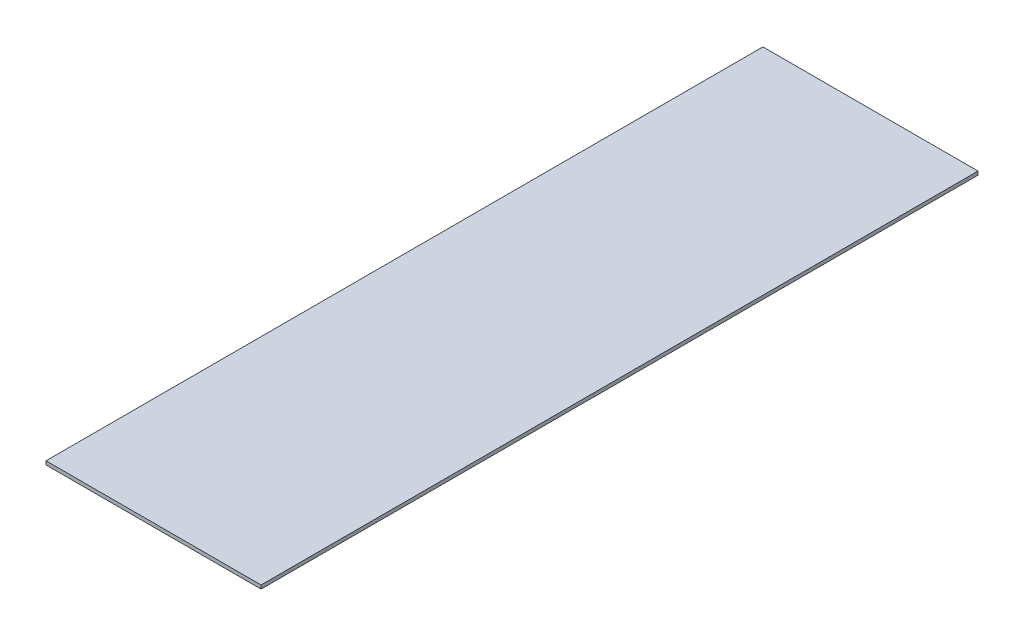
ISO-10303-21;
HEADER;
FILE_DESCRIPTION(('STEP AP214'),'2;1');
FILE_NAME('part.step','',(''),(''),'','','');
FILE_SCHEMA(('AUTOMOTIVE_DESIGN { 1 0 10303 214 1 1 1 1 }'));
ENDSEC;
DATA;
#1=APPLICATION_CONTEXT('core data for automotive mechanical design processes');
#2=APPLICATION_PROTOCOL_DEFINITION('international standard','automotive_design',2000,#1);
#3=PRODUCT_CONTEXT('',#1,'mechanical');
#4=PRODUCT('Part','Part','',(#3));
#5=PRODUCT_RELATED_PRODUCT_CATEGORY('part','',(#4));
#6=PRODUCT_DEFINITION_FORMATION('','',#4);
#7=PRODUCT_DEFINITION_CONTEXT('part definition',#1,'design');
#8=PRODUCT_DEFINITION('design','',#6,#7);
#9=PRODUCT_DEFINITION_SHAPE('','',#8);
#10=(LENGTH_UNIT() NAMED_UNIT(*) SI_UNIT(.MILLI.,.METRE.));
#11=(NAMED_UNIT(*) PLANE_ANGLE_UNIT() SI_UNIT($,.RADIAN.));
#12=(NAMED_UNIT(*) SI_UNIT($,.STERADIAN.) SOLID_ANGLE_UNIT());
#13=UNCERTAINTY_MEASURE_WITH_UNIT(LENGTH_MEASURE(1.E-05),#10,'distance_accuracy_value','');
#14=(GEOMETRIC_REPRESENTATION_CONTEXT(3) GLOBAL_UNCERTAINTY_ASSIGNED_CONTEXT((#13)) GLOBAL_UNIT_ASSIGNED_CONTEXT((#10,
#11,#12)) REPRESENTATION_CONTEXT('',''));
#15=CARTESIAN_POINT('',(0.,0.,0.));
#16=DIRECTION('',(0.,0.,1.));
#17=DIRECTION('',(1.,0.,0.));
#18=AXIS2_PLACEMENT_3D('',#15,#16,#17);
#19=CARTESIAN_POINT('',(0.,1.,100.));
#20=DIRECTION('',(1.,0.,0.));
#21=DIRECTION('',(0.,0.,-1.));
#22=AXIS2_PLACEMENT_3D('',#19,#20,#21);
#23=PLANE('',#22);
#24=DIRECTION('',(0.,0.,1.));
#25=VECTOR('',#24,1.);
#26=CARTESIAN_POINT('',(0.,0.,100.));
#27=LINE('',#26,#25);
#28=CARTESIAN_POINT('',(0.,0.,-100.));
#29=VERTEX_POINT('',#28);
#30=CARTESIAN_POINT('',(0.,0.,100.));
#31=VERTEX_POINT('',#30);
#32=EDGE_CURVE('E95',#29,#31,#27,.T.);
#33=ORIENTED_EDGE('',*,*,#32,.T.);
#34=DIRECTION('',(0.,-1.,0.));
#35=VECTOR('',#34,1.);
#36=CARTESIAN_POINT('',(0.,1.,100.));
#37=LINE('',#36,#35);
#38=CARTESIAN_POINT('',(0.,1.,100.));
#39=VERTEX_POINT('',#38);
#40=EDGE_CURVE('E11',#39,#31,#37,.T.);
#41=ORIENTED_EDGE('',*,*,#40,.F.);
#42=DIRECTION('',(0.,0.,1.));
#43=VECTOR('',#42,1.);
#44=CARTESIAN_POINT('',(0.,1.,100.));
#45=LINE('',#44,#43);
#46=CARTESIAN_POINT('',(0.,1.,-100.));
#47=VERTEX_POINT('',#46);
#48=EDGE_CURVE('E83',#47,#39,#45,.T.);
#49=ORIENTED_EDGE('',*,*,#48,.F.);
#50=DIRECTION('',(0.,-1.,0.));
#51=VECTOR('',#50,1.);
#52=CARTESIAN_POINT('',(0.,1.,-100.));
#53=LINE('',#52,#51);
#54=EDGE_CURVE('E91',#47,#29,#53,.T.);
#55=ORIENTED_EDGE('',*,*,#54,.T.);
#56=EDGE_LOOP('',(#33,#41,#49,#55));
#57=FACE_BOUND('',#56,.T.);
#58=ADVANCED_FACE('F32',(#57),#23,.F.);
#59=CARTESIAN_POINT('',(0.,1.,100.));
#60=DIRECTION('',(0.,0.,-1.));
#61=DIRECTION('',(-1.,0.,0.));
#62=AXIS2_PLACEMENT_3D('',#59,#60,#61);
#63=PLANE('',#62);
#64=DIRECTION('',(1.,0.,0.));
#65=VECTOR('',#64,1.);
#66=CARTESIAN_POINT('',(0.,0.,100.));
#67=LINE('',#66,#65);
#68=CARTESIAN_POINT('',(60.,0.,100.));
#69=VERTEX_POINT('',#68);
#70=EDGE_CURVE('E87',#31,#69,#67,.T.);
#71=ORIENTED_EDGE('',*,*,#70,.T.);
#72=DIRECTION('',(0.,-1.,0.));
#73=VECTOR('',#72,1.);
#74=CARTESIAN_POINT('',(60.,1.,100.));
#75=LINE('',#74,#73);
#76=CARTESIAN_POINT('',(60.,1.,100.));
#77=VERTEX_POINT('',#76);
#78=EDGE_CURVE('E40',#77,#69,#75,.T.);
#79=ORIENTED_EDGE('',*,*,#78,.F.);
#80=DIRECTION('',(1.,0.,0.));
#81=VECTOR('',#80,1.);
#82=CARTESIAN_POINT('',(0.,1.,100.));
#83=LINE('',#82,#81);
#84=EDGE_CURVE('E78',#39,#77,#83,.T.);
#85=ORIENTED_EDGE('',*,*,#84,.F.);
#86=ORIENTED_EDGE('',*,*,#40,.T.);
#87=EDGE_LOOP('',(#71,#79,#85,#86));
#88=FACE_BOUND('',#87,.T.);
#89=ADVANCED_FACE('F86',(#88),#63,.F.);
#90=CARTESIAN_POINT('',(60.,1.,100.));
#91=DIRECTION('',(-1.,0.,0.));
#92=DIRECTION('',(0.,0.,1.));
#93=AXIS2_PLACEMENT_3D('',#90,#91,#92);
#94=PLANE('',#93);
#95=DIRECTION('',(0.,0.,-1.));
#96=VECTOR('',#95,1.);
#97=CARTESIAN_POINT('',(60.,0.,100.));
#98=LINE('',#97,#96);
#99=CARTESIAN_POINT('',(60.,0.,-100.));
#100=VERTEX_POINT('',#99);
#101=EDGE_CURVE('E65',#69,#100,#98,.T.);
#102=ORIENTED_EDGE('',*,*,#101,.T.);
#103=DIRECTION('',(0.,-1.,0.));
#104=VECTOR('',#103,1.);
#105=CARTESIAN_POINT('',(60.,1.,-100.));
#106=LINE('',#105,#104);
#107=CARTESIAN_POINT('',(60.,1.,-100.));
#108=VERTEX_POINT('',#107);
#109=EDGE_CURVE('E88',#108,#100,#106,.T.);
#110=ORIENTED_EDGE('',*,*,#109,.F.);
#111=DIRECTION('',(0.,0.,-1.));
#112=VECTOR('',#111,1.);
#113=CARTESIAN_POINT('',(60.,1.,100.));
#114=LINE('',#113,#112);
#115=EDGE_CURVE('E81',#77,#108,#114,.T.);
#116=ORIENTED_EDGE('',*,*,#115,.F.);
#117=ORIENTED_EDGE('',*,*,#78,.T.);
#118=EDGE_LOOP('',(#102,#110,#116,#117));
#119=FACE_BOUND('',#118,.T.);
#120=ADVANCED_FACE('F89',(#119),#94,.F.);
#121=CARTESIAN_POINT('',(0.,1.,-100.));
#122=DIRECTION('',(0.,0.,1.));
#123=DIRECTION('',(1.,0.,0.));
#124=AXIS2_PLACEMENT_3D('',#121,#122,#123);
#125=PLANE('',#124);
#126=DIRECTION('',(-1.,0.,0.));
#127=VECTOR('',#126,1.);
#128=CARTESIAN_POINT('',(0.,0.,-100.));
#129=LINE('',#128,#127);
#130=EDGE_CURVE('E71',#100,#29,#129,.T.);
#131=ORIENTED_EDGE('',*,*,#130,.T.);
#132=ORIENTED_EDGE('',*,*,#54,.F.);
#133=DIRECTION('',(-1.,0.,0.));
#134=VECTOR('',#133,1.);
#135=CARTESIAN_POINT('',(0.,1.,-100.));
#136=LINE('',#135,#134);
#137=EDGE_CURVE('E48',#108,#47,#136,.T.);
#138=ORIENTED_EDGE('',*,*,#137,.F.);
#139=ORIENTED_EDGE('',*,*,#109,.T.);
#140=EDGE_LOOP('',(#131,#132,#138,#139));
#141=FACE_BOUND('',#140,.T.);
#142=ADVANCED_FACE('F102',(#141),#125,.F.);
#143=CARTESIAN_POINT('',(0.,1.,-100.));
#144=DIRECTION('',(0.,-1.,0.));
#145=DIRECTION('',(0.,0.,-1.));
#146=AXIS2_PLACEMENT_3D('',#143,#144,#145);
#147=PLANE('',#146);
#148=ORIENTED_EDGE('',*,*,#48,.T.);
#149=ORIENTED_EDGE('',*,*,#84,.T.);
#150=ORIENTED_EDGE('',*,*,#115,.T.);
#151=ORIENTED_EDGE('',*,*,#137,.T.);
#152=EDGE_LOOP('',(#148,#149,#150,#151));
#153=FACE_BOUND('',#152,.T.);
#154=ADVANCED_FACE('F79',(#153),#147,.F.);
#155=CARTESIAN_POINT('',(0.,0.,-100.));
#156=DIRECTION('',(0.,-1.,0.));
#157=DIRECTION('',(0.,0.,-1.));
#158=AXIS2_PLACEMENT_3D('',#155,#156,#157);
#159=PLANE('',#158);
#160=ORIENTED_EDGE('',*,*,#32,.F.);
#161=ORIENTED_EDGE('',*,*,#130,.F.);
#162=ORIENTED_EDGE('',*,*,#101,.F.);
#163=ORIENTED_EDGE('',*,*,#70,.F.);
#164=EDGE_LOOP('',(#160,#161,#162,#163));
#165=FACE_BOUND('',#164,.T.);
#166=ADVANCED_FACE('F105',(#165),#159,.T.);
#167=CLOSED_SHELL('',(#58,#89,#120,#142,#154,#166));
#168=MANIFOLD_SOLID_BREP('B2',#167);
#169=ADVANCED_BREP_SHAPE_REPRESENTATION('',(#18,#168),#14);
#170=SHAPE_DEFINITION_REPRESENTATION(#9,#169);
ENDSEC;
END-ISO-10303-21;
